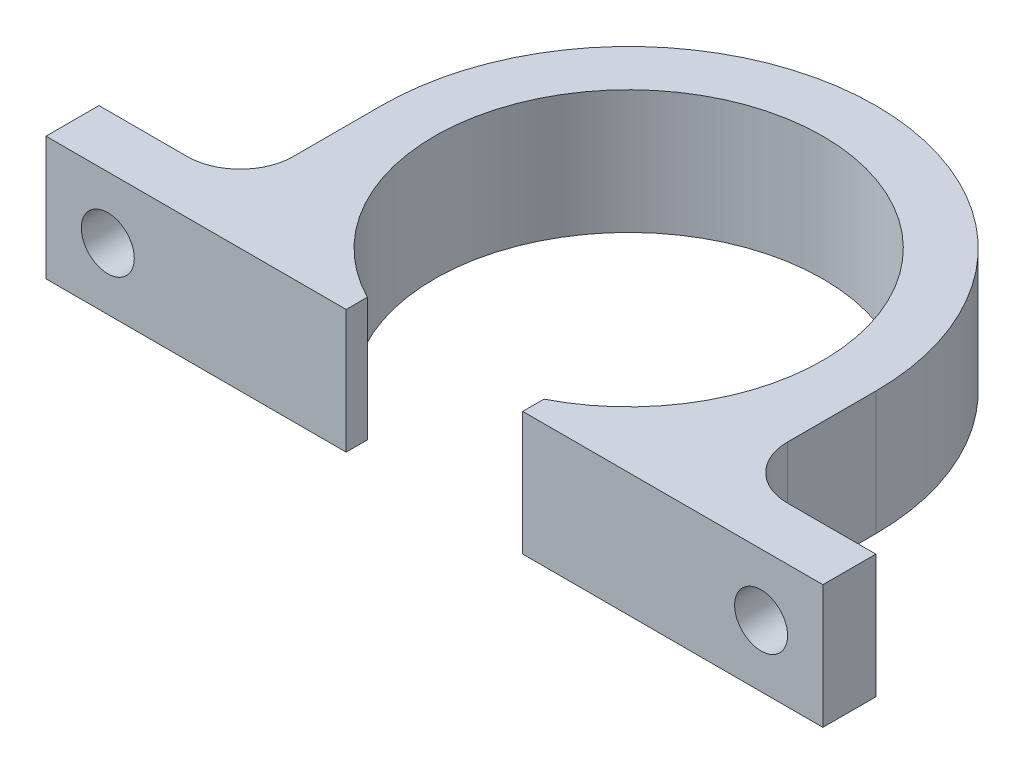
ISO-10303-21;
HEADER;
FILE_DESCRIPTION(('STEP AP214'),'2;1');
FILE_NAME('part.step','',(''),(''),'','','');
FILE_SCHEMA(('AUTOMOTIVE_DESIGN { 1 0 10303 214 1 1 1 1 }'));
ENDSEC;
DATA;
#1=APPLICATION_CONTEXT('core data for automotive mechanical design processes');
#2=APPLICATION_PROTOCOL_DEFINITION('international standard','automotive_design',2000,#1);
#3=PRODUCT_CONTEXT('',#1,'mechanical');
#4=PRODUCT('Part','Part','',(#3));
#5=PRODUCT_RELATED_PRODUCT_CATEGORY('part','',(#4));
#6=PRODUCT_DEFINITION_FORMATION('','',#4);
#7=PRODUCT_DEFINITION_CONTEXT('part definition',#1,'design');
#8=PRODUCT_DEFINITION('design','',#6,#7);
#9=PRODUCT_DEFINITION_SHAPE('','',#8);
#10=(LENGTH_UNIT() NAMED_UNIT(*) SI_UNIT(.MILLI.,.METRE.));
#11=(NAMED_UNIT(*) PLANE_ANGLE_UNIT() SI_UNIT($,.RADIAN.));
#12=(NAMED_UNIT(*) SI_UNIT($,.STERADIAN.) SOLID_ANGLE_UNIT());
#13=UNCERTAINTY_MEASURE_WITH_UNIT(LENGTH_MEASURE(1.E-05),#10,'distance_accuracy_value','');
#14=(GEOMETRIC_REPRESENTATION_CONTEXT(3) GLOBAL_UNCERTAINTY_ASSIGNED_CONTEXT((#13)) GLOBAL_UNIT_ASSIGNED_CONTEXT((#10,
#11,#12)) REPRESENTATION_CONTEXT('',''));
#15=CARTESIAN_POINT('',(0.,0.,0.));
#16=DIRECTION('',(0.,0.,1.));
#17=DIRECTION('',(1.,0.,0.));
#18=AXIS2_PLACEMENT_3D('',#15,#16,#17);
#19=CARTESIAN_POINT('',(0.,7.,0.));
#20=DIRECTION('',(0.,-1.,0.));
#21=DIRECTION('',(0.,0.,-1.));
#22=AXIS2_PLACEMENT_3D('',#19,#20,#21);
#23=CYLINDRICAL_SURFACE('',#22,11.);
#24=CARTESIAN_POINT('',(0.,0.,0.));
#25=DIRECTION('',(0.,1.,0.));
#26=DIRECTION('',(0.,0.,1.));
#27=AXIS2_PLACEMENT_3D('',#24,#25,#26);
#28=CIRCLE('',#27,11.);
#29=CARTESIAN_POINT('',(5.,0.,9.79795897113271));
#30=VERTEX_POINT('',#29);
#31=CARTESIAN_POINT('',(-5.,0.,9.79795897113271));
#32=VERTEX_POINT('',#31);
#33=EDGE_CURVE('E143',#30,#32,#28,.T.);
#34=ORIENTED_EDGE('',*,*,#33,.F.);
#35=DIRECTION('',(0.,-1.,0.));
#36=VECTOR('',#35,1.);
#37=CARTESIAN_POINT('',(5.,7.,9.79795897113271));
#38=LINE('',#37,#36);
#39=CARTESIAN_POINT('',(5.,7.,9.79795897113271));
#40=VERTEX_POINT('',#39);
#41=EDGE_CURVE('E139',#40,#30,#38,.T.);
#42=ORIENTED_EDGE('',*,*,#41,.F.);
#43=CARTESIAN_POINT('',(0.,7.,0.));
#44=DIRECTION('',(0.,1.,0.));
#45=DIRECTION('',(0.,0.,1.));
#46=AXIS2_PLACEMENT_3D('',#43,#44,#45);
#47=CIRCLE('',#46,11.);
#48=CARTESIAN_POINT('',(-5.,7.,9.79795897113271));
#49=VERTEX_POINT('',#48);
#50=EDGE_CURVE('E141',#40,#49,#47,.T.);
#51=ORIENTED_EDGE('',*,*,#50,.T.);
#52=DIRECTION('',(0.,-1.,0.));
#53=VECTOR('',#52,1.);
#54=CARTESIAN_POINT('',(-5.,7.,9.79795897113271));
#55=LINE('',#54,#53);
#56=EDGE_CURVE('E190',#49,#32,#55,.T.);
#57=ORIENTED_EDGE('',*,*,#56,.T.);
#58=EDGE_LOOP('',(#34,#42,#51,#57));
#59=FACE_BOUND('',#58,.T.);
#60=ADVANCED_FACE('F35',(#59),#23,.F.);
#61=CARTESIAN_POINT('',(5.,7.,0.));
#62=DIRECTION('',(-1.,0.,0.));
#63=DIRECTION('',(0.,0.,1.));
#64=AXIS2_PLACEMENT_3D('',#61,#62,#63);
#65=PLANE('',#64);
#66=DIRECTION('',(0.,0.,-1.));
#67=VECTOR('',#66,1.);
#68=CARTESIAN_POINT('',(5.,0.,0.));
#69=LINE('',#68,#67);
#70=CARTESIAN_POINT('',(5.,0.,11.));
#71=VERTEX_POINT('',#70);
#72=EDGE_CURVE('E192',#71,#30,#69,.T.);
#73=ORIENTED_EDGE('',*,*,#72,.F.);
#74=DIRECTION('',(0.,-1.,0.));
#75=VECTOR('',#74,1.);
#76=CARTESIAN_POINT('',(5.,7.,11.));
#77=LINE('',#76,#75);
#78=CARTESIAN_POINT('',(5.,7.,11.));
#79=VERTEX_POINT('',#78);
#80=EDGE_CURVE('E149',#79,#71,#77,.T.);
#81=ORIENTED_EDGE('',*,*,#80,.F.);
#82=DIRECTION('',(0.,0.,-1.));
#83=VECTOR('',#82,1.);
#84=CARTESIAN_POINT('',(5.,7.,0.));
#85=LINE('',#84,#83);
#86=EDGE_CURVE('E155',#79,#40,#85,.T.);
#87=ORIENTED_EDGE('',*,*,#86,.T.);
#88=ORIENTED_EDGE('',*,*,#41,.T.);
#89=EDGE_LOOP('',(#73,#81,#87,#88));
#90=FACE_BOUND('',#89,.T.);
#91=ADVANCED_FACE('F162',(#90),#65,.T.);
#92=CARTESIAN_POINT('',(0.,7.,11.));
#93=DIRECTION('',(0.,0.,1.));
#94=DIRECTION('',(1.,0.,0.));
#95=AXIS2_PLACEMENT_3D('',#92,#93,#94);
#96=PLANE('',#95);
#97=CARTESIAN_POINT('',(18.5,3.5,11.));
#98=DIRECTION('',(0.,0.,1.));
#99=DIRECTION('',(1.,0.,0.));
#100=AXIS2_PLACEMENT_3D('',#97,#98,#99);
#101=CIRCLE('',#100,1.5);
#102=CARTESIAN_POINT('',(20.,3.5,11.));
#103=VERTEX_POINT('',#102);
#104=EDGE_CURVE('E470',#103,#103,#101,.T.);
#105=ORIENTED_EDGE('',*,*,#104,.F.);
#106=EDGE_LOOP('',(#105));
#107=FACE_BOUND('',#106,.T.);
#108=DIRECTION('',(-1.,0.,0.));
#109=VECTOR('',#108,1.);
#110=CARTESIAN_POINT('',(0.,0.,11.));
#111=LINE('',#110,#109);
#112=CARTESIAN_POINT('',(22.,0.,11.));
#113=VERTEX_POINT('',#112);
#114=EDGE_CURVE('E194',#113,#71,#111,.T.);
#115=ORIENTED_EDGE('',*,*,#114,.F.);
#116=DIRECTION('',(0.,-1.,0.));
#117=VECTOR('',#116,1.);
#118=CARTESIAN_POINT('',(22.,7.,11.));
#119=LINE('',#118,#117);
#120=CARTESIAN_POINT('',(22.,7.,11.));
#121=VERTEX_POINT('',#120);
#122=EDGE_CURVE('E236',#121,#113,#119,.T.);
#123=ORIENTED_EDGE('',*,*,#122,.F.);
#124=DIRECTION('',(-1.,0.,0.));
#125=VECTOR('',#124,1.);
#126=CARTESIAN_POINT('',(0.,7.,11.));
#127=LINE('',#126,#125);
#128=EDGE_CURVE('E163',#121,#79,#127,.T.);
#129=ORIENTED_EDGE('',*,*,#128,.T.);
#130=ORIENTED_EDGE('',*,*,#80,.T.);
#131=EDGE_LOOP('',(#115,#123,#129,#130));
#132=FACE_BOUND('',#131,.T.);
#133=ADVANCED_FACE('F288',(#107,#132),#96,.T.);
#134=CARTESIAN_POINT('',(22.,7.,0.));
#135=DIRECTION('',(-1.,0.,0.));
#136=DIRECTION('',(0.,0.,1.));
#137=AXIS2_PLACEMENT_3D('',#134,#135,#136);
#138=PLANE('',#137);
#139=DIRECTION('',(0.,0.,-1.));
#140=VECTOR('',#139,1.);
#141=CARTESIAN_POINT('',(22.,0.,0.));
#142=LINE('',#141,#140);
#143=CARTESIAN_POINT('',(22.,0.,8.));
#144=VERTEX_POINT('',#143);
#145=EDGE_CURVE('E197',#113,#144,#142,.T.);
#146=ORIENTED_EDGE('',*,*,#145,.T.);
#147=DIRECTION('',(0.,-1.,0.));
#148=VECTOR('',#147,1.);
#149=CARTESIAN_POINT('',(22.,7.,8.));
#150=LINE('',#149,#148);
#151=CARTESIAN_POINT('',(22.,7.,8.));
#152=VERTEX_POINT('',#151);
#153=EDGE_CURVE('E233',#152,#144,#150,.T.);
#154=ORIENTED_EDGE('',*,*,#153,.F.);
#155=DIRECTION('',(0.,0.,-1.));
#156=VECTOR('',#155,1.);
#157=CARTESIAN_POINT('',(22.,7.,0.));
#158=LINE('',#157,#156);
#159=EDGE_CURVE('E165',#121,#152,#158,.T.);
#160=ORIENTED_EDGE('',*,*,#159,.F.);
#161=ORIENTED_EDGE('',*,*,#122,.T.);
#162=EDGE_LOOP('',(#146,#154,#160,#161));
#163=FACE_BOUND('',#162,.T.);
#164=ADVANCED_FACE('F294',(#163),#138,.F.);
#165=CARTESIAN_POINT('',(0.,7.,8.));
#166=DIRECTION('',(0.,0.,1.));
#167=DIRECTION('',(1.,0.,0.));
#168=AXIS2_PLACEMENT_3D('',#165,#166,#167);
#169=PLANE('',#168);
#170=DIRECTION('',(0.,-1.,0.));
#171=VECTOR('',#170,1.);
#172=CARTESIAN_POINT('',(17.,7.,8.));
#173=LINE('',#172,#171);
#174=CARTESIAN_POINT('',(17.,0.,8.));
#175=VERTEX_POINT('',#174);
#176=CARTESIAN_POINT('',(17.,3.5,8.));
#177=VERTEX_POINT('',#176);
#178=EDGE_CURVE('E242',#175,#177,#173,.F.);
#179=ORIENTED_EDGE('',*,*,#178,.T.);
#180=CARTESIAN_POINT('',(18.5,3.5,8.));
#181=DIRECTION('',(0.,0.,1.));
#182=DIRECTION('',(1.,0.,0.));
#183=AXIS2_PLACEMENT_3D('',#180,#181,#182);
#184=CIRCLE('',#183,1.5);
#185=EDGE_CURVE('E48',#177,#177,#184,.T.);
#186=ORIENTED_EDGE('',*,*,#185,.T.);
#187=CARTESIAN_POINT('',(17.,7.,8.));
#188=VERTEX_POINT('',#187);
#189=EDGE_CURVE('E241',#177,#188,#173,.F.);
#190=ORIENTED_EDGE('',*,*,#189,.T.);
#191=DIRECTION('',(-1.,0.,0.));
#192=VECTOR('',#191,1.);
#193=CARTESIAN_POINT('',(0.,7.,8.));
#194=LINE('',#193,#192);
#195=EDGE_CURVE('E170',#152,#188,#194,.T.);
#196=ORIENTED_EDGE('',*,*,#195,.F.);
#197=ORIENTED_EDGE('',*,*,#153,.T.);
#198=DIRECTION('',(-1.,0.,0.));
#199=VECTOR('',#198,1.);
#200=CARTESIAN_POINT('',(0.,0.,8.));
#201=LINE('',#200,#199);
#202=EDGE_CURVE('E199',#144,#175,#201,.T.);
#203=ORIENTED_EDGE('',*,*,#202,.T.);
#204=EDGE_LOOP('',(#179,#186,#190,#196,#197,#203));
#205=FACE_BOUND('',#204,.T.);
#206=ADVANCED_FACE('F296',(#205),#169,.F.);
#207=CARTESIAN_POINT('',(14.,7.,0.));
#208=DIRECTION('',(1.,0.,0.));
#209=DIRECTION('',(0.,0.,-1.));
#210=AXIS2_PLACEMENT_3D('',#207,#208,#209);
#211=PLANE('',#210);
#212=DIRECTION('',(0.,0.,1.));
#213=VECTOR('',#212,1.);
#214=CARTESIAN_POINT('',(14.,7.,0.));
#215=LINE('',#214,#213);
#216=CARTESIAN_POINT('',(14.,7.,0.));
#217=VERTEX_POINT('',#216);
#218=CARTESIAN_POINT('',(14.,7.,5.));
#219=VERTEX_POINT('',#218);
#220=EDGE_CURVE('E173',#217,#219,#215,.T.);
#221=ORIENTED_EDGE('',*,*,#220,.T.);
#222=DIRECTION('',(0.,-1.,0.));
#223=VECTOR('',#222,1.);
#224=CARTESIAN_POINT('',(14.,7.,5.));
#225=LINE('',#224,#223);
#226=CARTESIAN_POINT('',(14.,0.,5.));
#227=VERTEX_POINT('',#226);
#228=EDGE_CURVE('E148',#219,#227,#225,.T.);
#229=ORIENTED_EDGE('',*,*,#228,.T.);
#230=DIRECTION('',(0.,0.,1.));
#231=VECTOR('',#230,1.);
#232=CARTESIAN_POINT('',(14.,0.,0.));
#233=LINE('',#232,#231);
#234=CARTESIAN_POINT('',(14.,0.,0.));
#235=VERTEX_POINT('',#234);
#236=EDGE_CURVE('E202',#235,#227,#233,.T.);
#237=ORIENTED_EDGE('',*,*,#236,.F.);
#238=DIRECTION('',(0.,-1.,0.));
#239=VECTOR('',#238,1.);
#240=CARTESIAN_POINT('',(14.,7.,0.));
#241=LINE('',#240,#239);
#242=EDGE_CURVE('E231',#217,#235,#241,.T.);
#243=ORIENTED_EDGE('',*,*,#242,.F.);
#244=EDGE_LOOP('',(#221,#229,#237,#243));
#245=FACE_BOUND('',#244,.T.);
#246=ADVANCED_FACE('F304',(#245),#211,.T.);
#247=CARTESIAN_POINT('',(0.,7.,0.));
#248=DIRECTION('',(0.,-1.,0.));
#249=DIRECTION('',(0.,0.,-1.));
#250=AXIS2_PLACEMENT_3D('',#247,#248,#249);
#251=CYLINDRICAL_SURFACE('',#250,14.);
#252=CARTESIAN_POINT('',(0.,0.,0.));
#253=DIRECTION('',(0.,1.,0.));
#254=DIRECTION('',(0.,0.,1.));
#255=AXIS2_PLACEMENT_3D('',#252,#253,#254);
#256=CIRCLE('',#255,14.);
#257=CARTESIAN_POINT('',(-14.,0.,0.));
#258=VERTEX_POINT('',#257);
#259=EDGE_CURVE('E205',#235,#258,#256,.T.);
#260=ORIENTED_EDGE('',*,*,#259,.T.);
#261=DIRECTION('',(0.,-1.,0.));
#262=VECTOR('',#261,1.);
#263=CARTESIAN_POINT('',(-14.,7.,0.));
#264=LINE('',#263,#262);
#265=CARTESIAN_POINT('',(-14.,7.,0.));
#266=VERTEX_POINT('',#265);
#267=EDGE_CURVE('E228',#266,#258,#264,.T.);
#268=ORIENTED_EDGE('',*,*,#267,.F.);
#269=CARTESIAN_POINT('',(0.,7.,0.));
#270=DIRECTION('',(0.,1.,0.));
#271=DIRECTION('',(0.,0.,1.));
#272=AXIS2_PLACEMENT_3D('',#269,#270,#271);
#273=CIRCLE('',#272,14.);
#274=EDGE_CURVE('E176',#217,#266,#273,.T.);
#275=ORIENTED_EDGE('',*,*,#274,.F.);
#276=ORIENTED_EDGE('',*,*,#242,.T.);
#277=EDGE_LOOP('',(#260,#268,#275,#276));
#278=FACE_BOUND('',#277,.T.);
#279=ADVANCED_FACE('F308',(#278),#251,.T.);
#280=CARTESIAN_POINT('',(-14.,7.,0.));
#281=DIRECTION('',(1.,0.,0.));
#282=DIRECTION('',(0.,0.,-1.));
#283=AXIS2_PLACEMENT_3D('',#280,#281,#282);
#284=PLANE('',#283);
#285=DIRECTION('',(0.,0.,1.));
#286=VECTOR('',#285,1.);
#287=CARTESIAN_POINT('',(-14.,0.,0.));
#288=LINE('',#287,#286);
#289=CARTESIAN_POINT('',(-14.,0.,5.));
#290=VERTEX_POINT('',#289);
#291=EDGE_CURVE('E207',#258,#290,#288,.T.);
#292=ORIENTED_EDGE('',*,*,#291,.T.);
#293=DIRECTION('',(0.,-1.,0.));
#294=VECTOR('',#293,1.);
#295=CARTESIAN_POINT('',(-14.,7.,5.));
#296=LINE('',#295,#294);
#297=CARTESIAN_POINT('',(-14.,7.,5.));
#298=VERTEX_POINT('',#297);
#299=EDGE_CURVE('E253',#290,#298,#296,.F.);
#300=ORIENTED_EDGE('',*,*,#299,.T.);
#301=DIRECTION('',(0.,0.,1.));
#302=VECTOR('',#301,1.);
#303=CARTESIAN_POINT('',(-14.,7.,0.));
#304=LINE('',#303,#302);
#305=EDGE_CURVE('E178',#266,#298,#304,.T.);
#306=ORIENTED_EDGE('',*,*,#305,.F.);
#307=ORIENTED_EDGE('',*,*,#267,.T.);
#308=EDGE_LOOP('',(#292,#300,#306,#307));
#309=FACE_BOUND('',#308,.T.);
#310=ADVANCED_FACE('F264',(#309),#284,.F.);
#311=CARTESIAN_POINT('',(0.,7.,8.));
#312=DIRECTION('',(0.,0.,-1.));
#313=DIRECTION('',(-1.,0.,0.));
#314=AXIS2_PLACEMENT_3D('',#311,#312,#313);
#315=PLANE('',#314);
#316=DIRECTION('',(0.,-1.,0.));
#317=VECTOR('',#316,1.);
#318=CARTESIAN_POINT('',(-17.,7.,8.));
#319=LINE('',#318,#317);
#320=CARTESIAN_POINT('',(-17.,7.,8.));
#321=VERTEX_POINT('',#320);
#322=CARTESIAN_POINT('',(-17.,3.5,8.));
#323=VERTEX_POINT('',#322);
#324=EDGE_CURVE('E250',#321,#323,#319,.T.);
#325=ORIENTED_EDGE('',*,*,#324,.T.);
#326=CARTESIAN_POINT('',(-18.5,3.5,8.));
#327=DIRECTION('',(0.,0.,-1.));
#328=DIRECTION('',(-1.,0.,0.));
#329=AXIS2_PLACEMENT_3D('',#326,#327,#328);
#330=CIRCLE('',#329,1.5);
#331=EDGE_CURVE('E53',#323,#323,#330,.T.);
#332=ORIENTED_EDGE('',*,*,#331,.F.);
#333=CARTESIAN_POINT('',(-17.,0.,8.));
#334=VERTEX_POINT('',#333);
#335=EDGE_CURVE('E249',#323,#334,#319,.T.);
#336=ORIENTED_EDGE('',*,*,#335,.T.);
#337=DIRECTION('',(1.,0.,0.));
#338=VECTOR('',#337,1.);
#339=CARTESIAN_POINT('',(0.,0.,8.));
#340=LINE('',#339,#338);
#341=CARTESIAN_POINT('',(-22.,0.,8.));
#342=VERTEX_POINT('',#341);
#343=EDGE_CURVE('E210',#342,#334,#340,.T.);
#344=ORIENTED_EDGE('',*,*,#343,.F.);
#345=DIRECTION('',(0.,-1.,0.));
#346=VECTOR('',#345,1.);
#347=CARTESIAN_POINT('',(-22.,7.,8.));
#348=LINE('',#347,#346);
#349=CARTESIAN_POINT('',(-22.,7.,8.));
#350=VERTEX_POINT('',#349);
#351=EDGE_CURVE('E226',#350,#342,#348,.T.);
#352=ORIENTED_EDGE('',*,*,#351,.F.);
#353=DIRECTION('',(1.,0.,0.));
#354=VECTOR('',#353,1.);
#355=CARTESIAN_POINT('',(0.,7.,8.));
#356=LINE('',#355,#354);
#357=EDGE_CURVE('E181',#350,#321,#356,.T.);
#358=ORIENTED_EDGE('',*,*,#357,.T.);
#359=EDGE_LOOP('',(#325,#332,#336,#344,#352,#358));
#360=FACE_BOUND('',#359,.T.);
#361=ADVANCED_FACE('F272',(#360),#315,.T.);
#362=CARTESIAN_POINT('',(-22.,7.,0.));
#363=DIRECTION('',(-1.,0.,0.));
#364=DIRECTION('',(0.,0.,1.));
#365=AXIS2_PLACEMENT_3D('',#362,#363,#364);
#366=PLANE('',#365);
#367=DIRECTION('',(0.,0.,-1.));
#368=VECTOR('',#367,1.);
#369=CARTESIAN_POINT('',(-22.,0.,0.));
#370=LINE('',#369,#368);
#371=CARTESIAN_POINT('',(-22.,0.,11.));
#372=VERTEX_POINT('',#371);
#373=EDGE_CURVE('E213',#372,#342,#370,.T.);
#374=ORIENTED_EDGE('',*,*,#373,.F.);
#375=DIRECTION('',(0.,-1.,0.));
#376=VECTOR('',#375,1.);
#377=CARTESIAN_POINT('',(-22.,7.,11.));
#378=LINE('',#377,#376);
#379=CARTESIAN_POINT('',(-22.,7.,11.));
#380=VERTEX_POINT('',#379);
#381=EDGE_CURVE('E224',#380,#372,#378,.T.);
#382=ORIENTED_EDGE('',*,*,#381,.F.);
#383=DIRECTION('',(0.,0.,-1.));
#384=VECTOR('',#383,1.);
#385=CARTESIAN_POINT('',(-22.,7.,0.));
#386=LINE('',#385,#384);
#387=EDGE_CURVE('E184',#380,#350,#386,.T.);
#388=ORIENTED_EDGE('',*,*,#387,.T.);
#389=ORIENTED_EDGE('',*,*,#351,.T.);
#390=EDGE_LOOP('',(#374,#382,#388,#389));
#391=FACE_BOUND('',#390,.T.);
#392=ADVANCED_FACE('F275',(#391),#366,.T.);
#393=CARTESIAN_POINT('',(0.,7.,11.));
#394=DIRECTION('',(0.,0.,-1.));
#395=DIRECTION('',(-1.,0.,0.));
#396=AXIS2_PLACEMENT_3D('',#393,#394,#395);
#397=PLANE('',#396);
#398=CARTESIAN_POINT('',(-18.5,3.5,11.));
#399=DIRECTION('',(0.,0.,1.));
#400=DIRECTION('',(1.,0.,0.));
#401=AXIS2_PLACEMENT_3D('',#398,#399,#400);
#402=CIRCLE('',#401,1.5);
#403=CARTESIAN_POINT('',(-17.,3.5,11.));
#404=VERTEX_POINT('',#403);
#405=EDGE_CURVE('E472',#404,#404,#402,.T.);
#406=ORIENTED_EDGE('',*,*,#405,.F.);
#407=EDGE_LOOP('',(#406));
#408=FACE_BOUND('',#407,.T.);
#409=DIRECTION('',(1.,0.,0.));
#410=VECTOR('',#409,1.);
#411=CARTESIAN_POINT('',(0.,0.,11.));
#412=LINE('',#411,#410);
#413=CARTESIAN_POINT('',(-5.,0.,11.));
#414=VERTEX_POINT('',#413);
#415=EDGE_CURVE('E216',#372,#414,#412,.T.);
#416=ORIENTED_EDGE('',*,*,#415,.T.);
#417=DIRECTION('',(0.,-1.,0.));
#418=VECTOR('',#417,1.);
#419=CARTESIAN_POINT('',(-5.,7.,11.));
#420=LINE('',#419,#418);
#421=CARTESIAN_POINT('',(-5.,7.,11.));
#422=VERTEX_POINT('',#421);
#423=EDGE_CURVE('E221',#422,#414,#420,.T.);
#424=ORIENTED_EDGE('',*,*,#423,.F.);
#425=DIRECTION('',(1.,0.,0.));
#426=VECTOR('',#425,1.);
#427=CARTESIAN_POINT('',(0.,7.,11.));
#428=LINE('',#427,#426);
#429=EDGE_CURVE('E187',#380,#422,#428,.T.);
#430=ORIENTED_EDGE('',*,*,#429,.F.);
#431=ORIENTED_EDGE('',*,*,#381,.T.);
#432=EDGE_LOOP('',(#416,#424,#430,#431));
#433=FACE_BOUND('',#432,.T.);
#434=ADVANCED_FACE('F279',(#408,#433),#397,.F.);
#435=CARTESIAN_POINT('',(-5.,7.,0.));
#436=DIRECTION('',(-1.,0.,0.));
#437=DIRECTION('',(0.,0.,1.));
#438=AXIS2_PLACEMENT_3D('',#435,#436,#437);
#439=PLANE('',#438);
#440=DIRECTION('',(0.,0.,-1.));
#441=VECTOR('',#440,1.);
#442=CARTESIAN_POINT('',(-5.,0.,0.));
#443=LINE('',#442,#441);
#444=EDGE_CURVE('E160',#414,#32,#443,.T.);
#445=ORIENTED_EDGE('',*,*,#444,.T.);
#446=ORIENTED_EDGE('',*,*,#56,.F.);
#447=DIRECTION('',(0.,0.,-1.));
#448=VECTOR('',#447,1.);
#449=CARTESIAN_POINT('',(-5.,7.,0.));
#450=LINE('',#449,#448);
#451=EDGE_CURVE('E158',#422,#49,#450,.T.);
#452=ORIENTED_EDGE('',*,*,#451,.F.);
#453=ORIENTED_EDGE('',*,*,#423,.T.);
#454=EDGE_LOOP('',(#445,#446,#452,#453));
#455=FACE_BOUND('',#454,.T.);
#456=ADVANCED_FACE('F283',(#455),#439,.F.);
#457=CARTESIAN_POINT('',(0.,7.,0.));
#458=DIRECTION('',(0.,1.,0.));
#459=DIRECTION('',(0.,0.,1.));
#460=AXIS2_PLACEMENT_3D('',#457,#458,#459);
#461=PLANE('',#460);
#462=ORIENTED_EDGE('',*,*,#50,.F.);
#463=ORIENTED_EDGE('',*,*,#86,.F.);
#464=ORIENTED_EDGE('',*,*,#128,.F.);
#465=ORIENTED_EDGE('',*,*,#159,.T.);
#466=ORIENTED_EDGE('',*,*,#195,.T.);
#467=CARTESIAN_POINT('',(17.,7.,5.));
#468=DIRECTION('',(0.,1.,0.));
#469=DIRECTION('',(0.,0.,1.));
#470=AXIS2_PLACEMENT_3D('',#467,#468,#469);
#471=CIRCLE('',#470,3.);
#472=EDGE_CURVE('E247',#188,#219,#471,.F.);
#473=ORIENTED_EDGE('',*,*,#472,.T.);
#474=ORIENTED_EDGE('',*,*,#220,.F.);
#475=ORIENTED_EDGE('',*,*,#274,.T.);
#476=ORIENTED_EDGE('',*,*,#305,.T.);
#477=CARTESIAN_POINT('',(-17.,7.,5.));
#478=DIRECTION('',(0.,1.,0.));
#479=DIRECTION('',(0.,0.,1.));
#480=AXIS2_PLACEMENT_3D('',#477,#478,#479);
#481=CIRCLE('',#480,3.);
#482=EDGE_CURVE('E11',#298,#321,#481,.F.);
#483=ORIENTED_EDGE('',*,*,#482,.T.);
#484=ORIENTED_EDGE('',*,*,#357,.F.);
#485=ORIENTED_EDGE('',*,*,#387,.F.);
#486=ORIENTED_EDGE('',*,*,#429,.T.);
#487=ORIENTED_EDGE('',*,*,#451,.T.);
#488=EDGE_LOOP('',(#462,#463,#464,#465,#466,#473,#474,#475,#476,#483,#484,#485,#486,#487));
#489=FACE_BOUND('',#488,.T.);
#490=ADVANCED_FACE('F153',(#489),#461,.T.);
#491=CARTESIAN_POINT('',(0.,0.,0.));
#492=DIRECTION('',(0.,1.,0.));
#493=DIRECTION('',(0.,0.,1.));
#494=AXIS2_PLACEMENT_3D('',#491,#492,#493);
#495=PLANE('',#494);
#496=ORIENTED_EDGE('',*,*,#33,.T.);
#497=ORIENTED_EDGE('',*,*,#444,.F.);
#498=ORIENTED_EDGE('',*,*,#415,.F.);
#499=ORIENTED_EDGE('',*,*,#373,.T.);
#500=ORIENTED_EDGE('',*,*,#343,.T.);
#501=CARTESIAN_POINT('',(-17.,0.,5.));
#502=DIRECTION('',(0.,1.,0.));
#503=DIRECTION('',(0.,0.,1.));
#504=AXIS2_PLACEMENT_3D('',#501,#502,#503);
#505=CIRCLE('',#504,3.);
#506=EDGE_CURVE('E43',#334,#290,#505,.T.);
#507=ORIENTED_EDGE('',*,*,#506,.T.);
#508=ORIENTED_EDGE('',*,*,#291,.F.);
#509=ORIENTED_EDGE('',*,*,#259,.F.);
#510=ORIENTED_EDGE('',*,*,#236,.T.);
#511=CARTESIAN_POINT('',(17.,0.,5.));
#512=DIRECTION('',(0.,1.,0.));
#513=DIRECTION('',(0.,0.,1.));
#514=AXIS2_PLACEMENT_3D('',#511,#512,#513);
#515=CIRCLE('',#514,3.);
#516=EDGE_CURVE('E245',#227,#175,#515,.T.);
#517=ORIENTED_EDGE('',*,*,#516,.T.);
#518=ORIENTED_EDGE('',*,*,#202,.F.);
#519=ORIENTED_EDGE('',*,*,#145,.F.);
#520=ORIENTED_EDGE('',*,*,#114,.T.);
#521=ORIENTED_EDGE('',*,*,#72,.T.);
#522=EDGE_LOOP('',(#496,#497,#498,#499,#500,#507,#508,#509,#510,#517,#518,#519,#520,#521));
#523=FACE_BOUND('',#522,.T.);
#524=ADVANCED_FACE('F257',(#523),#495,.F.);
#525=CARTESIAN_POINT('',(17.,7.,5.));
#526=DIRECTION('',(0.,-1.,0.));
#527=DIRECTION('',(0.,0.,-1.));
#528=AXIS2_PLACEMENT_3D('',#525,#526,#527);
#529=CYLINDRICAL_SURFACE('',#528,3.);
#530=ORIENTED_EDGE('',*,*,#472,.F.);
#531=ORIENTED_EDGE('',*,*,#189,.F.);
#532=ORIENTED_EDGE('',*,*,#178,.F.);
#533=ORIENTED_EDGE('',*,*,#516,.F.);
#534=ORIENTED_EDGE('',*,*,#228,.F.);
#535=EDGE_LOOP('',(#530,#531,#532,#533,#534));
#536=FACE_BOUND('',#535,.T.);
#537=ADVANCED_FACE('F300',(#536),#529,.F.);
#538=CARTESIAN_POINT('',(-17.,7.,5.));
#539=DIRECTION('',(0.,-1.,0.));
#540=DIRECTION('',(0.,0.,-1.));
#541=AXIS2_PLACEMENT_3D('',#538,#539,#540);
#542=CYLINDRICAL_SURFACE('',#541,3.);
#543=ORIENTED_EDGE('',*,*,#482,.F.);
#544=ORIENTED_EDGE('',*,*,#299,.F.);
#545=ORIENTED_EDGE('',*,*,#506,.F.);
#546=ORIENTED_EDGE('',*,*,#335,.F.);
#547=ORIENTED_EDGE('',*,*,#324,.F.);
#548=EDGE_LOOP('',(#543,#544,#545,#546,#547));
#549=FACE_BOUND('',#548,.T.);
#550=ADVANCED_FACE('F37',(#549),#542,.F.);
#551=CARTESIAN_POINT('',(-18.5,3.5,4.));
#552=DIRECTION('',(0.,0.,1.));
#553=DIRECTION('',(1.,0.,0.));
#554=AXIS2_PLACEMENT_3D('',#551,#552,#553);
#555=CYLINDRICAL_SURFACE('',#554,1.5);
#556=ORIENTED_EDGE('',*,*,#331,.T.);
#557=EDGE_LOOP('',(#556));
#558=FACE_BOUND('',#557,.T.);
#559=ORIENTED_EDGE('',*,*,#405,.T.);
#560=EDGE_LOOP('',(#559));
#561=FACE_BOUND('',#560,.T.);
#562=ADVANCED_FACE('F329',(#558,#561),#555,.F.);
#563=CARTESIAN_POINT('',(18.5,3.5,4.));
#564=DIRECTION('',(0.,0.,1.));
#565=DIRECTION('',(1.,0.,0.));
#566=AXIS2_PLACEMENT_3D('',#563,#564,#565);
#567=CYLINDRICAL_SURFACE('',#566,1.5);
#568=ORIENTED_EDGE('',*,*,#104,.T.);
#569=EDGE_LOOP('',(#568));
#570=FACE_BOUND('',#569,.T.);
#571=ORIENTED_EDGE('',*,*,#185,.F.);
#572=EDGE_LOOP('',(#571));
#573=FACE_BOUND('',#572,.T.);
#574=ADVANCED_FACE('F480',(#570,#573),#567,.F.);
#575=CLOSED_SHELL('',(#60,#91,#133,#164,#206,#246,#279,#310,#361,#392,#434,#456,#490,#524,#537,
#550,#562,#574));
#576=MANIFOLD_SOLID_BREP('B2',#575);
#577=ADVANCED_BREP_SHAPE_REPRESENTATION('',(#18,#576),#14);
#578=SHAPE_DEFINITION_REPRESENTATION(#9,#577);
ENDSEC;
END-ISO-10303-21;
